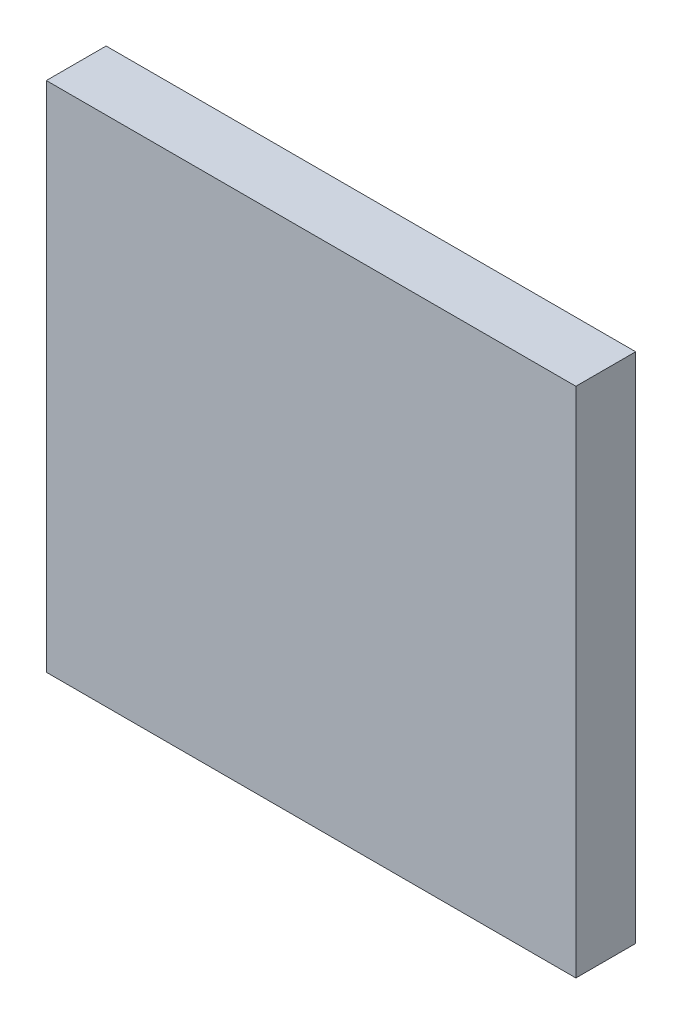
ISO-10303-21;
HEADER;
FILE_DESCRIPTION(('STEP AP214'),'2;1');
FILE_NAME('part.step','',(''),(''),'','','');
FILE_SCHEMA(('AUTOMOTIVE_DESIGN { 1 0 10303 214 1 1 1 1 }'));
ENDSEC;
DATA;
#1=APPLICATION_CONTEXT('core data for automotive mechanical design processes');
#2=APPLICATION_PROTOCOL_DEFINITION('international standard','automotive_design',2000,#1);
#3=PRODUCT_CONTEXT('',#1,'mechanical');
#4=PRODUCT('Part','Part','',(#3));
#5=PRODUCT_RELATED_PRODUCT_CATEGORY('part','',(#4));
#6=PRODUCT_DEFINITION_FORMATION('','',#4);
#7=PRODUCT_DEFINITION_CONTEXT('part definition',#1,'design');
#8=PRODUCT_DEFINITION('design','',#6,#7);
#9=PRODUCT_DEFINITION_SHAPE('','',#8);
#10=(LENGTH_UNIT() NAMED_UNIT(*) SI_UNIT(.MILLI.,.METRE.));
#11=(NAMED_UNIT(*) PLANE_ANGLE_UNIT() SI_UNIT($,.RADIAN.));
#12=(NAMED_UNIT(*) SI_UNIT($,.STERADIAN.) SOLID_ANGLE_UNIT());
#13=UNCERTAINTY_MEASURE_WITH_UNIT(LENGTH_MEASURE(1.E-05),#10,'distance_accuracy_value','');
#14=(GEOMETRIC_REPRESENTATION_CONTEXT(3) GLOBAL_UNCERTAINTY_ASSIGNED_CONTEXT((#13)) GLOBAL_UNIT_ASSIGNED_CONTEXT((#10,
#11,#12)) REPRESENTATION_CONTEXT('',''));
#15=CARTESIAN_POINT('',(0.,0.,0.));
#16=DIRECTION('',(0.,0.,1.));
#17=DIRECTION('',(1.,0.,0.));
#18=AXIS2_PLACEMENT_3D('',#15,#16,#17);
#19=CARTESIAN_POINT('',(0.,0.,1.4));
#20=DIRECTION('',(0.,0.,1.));
#21=DIRECTION('',(1.,0.,0.));
#22=AXIS2_PLACEMENT_3D('',#19,#20,#21);
#23=PLANE('',#22);
#24=DIRECTION('',(0.,1.,0.));
#25=VECTOR('',#24,1.);
#26=CARTESIAN_POINT('',(0.,0.,1.4));
#27=LINE('',#26,#25);
#28=CARTESIAN_POINT('',(0.,0.,1.4));
#29=VERTEX_POINT('',#28);
#30=CARTESIAN_POINT('',(0.,12.,1.4));
#31=VERTEX_POINT('',#30);
#32=EDGE_CURVE('E90',#29,#31,#27,.T.);
#33=ORIENTED_EDGE('',*,*,#32,.F.);
#34=DIRECTION('',(1.,0.,0.));
#35=VECTOR('',#34,1.);
#36=CARTESIAN_POINT('',(0.,0.,1.4));
#37=LINE('',#36,#35);
#38=CARTESIAN_POINT('',(12.4,0.,1.4));
#39=VERTEX_POINT('',#38);
#40=EDGE_CURVE('E21',#29,#39,#37,.T.);
#41=ORIENTED_EDGE('',*,*,#40,.T.);
#42=DIRECTION('',(0.,1.,0.));
#43=VECTOR('',#42,1.);
#44=CARTESIAN_POINT('',(12.4,0.,1.4));
#45=LINE('',#44,#43);
#46=CARTESIAN_POINT('',(12.4,12.,1.4));
#47=VERTEX_POINT('',#46);
#48=EDGE_CURVE('E82',#39,#47,#45,.T.);
#49=ORIENTED_EDGE('',*,*,#48,.T.);
#50=DIRECTION('',(1.,0.,0.));
#51=VECTOR('',#50,1.);
#52=CARTESIAN_POINT('',(0.,12.,1.4));
#53=LINE('',#52,#51);
#54=EDGE_CURVE('E11',#31,#47,#53,.T.);
#55=ORIENTED_EDGE('',*,*,#54,.F.);
#56=EDGE_LOOP('',(#33,#41,#49,#55));
#57=FACE_BOUND('',#56,.T.);
#58=ADVANCED_FACE('F17',(#57),#23,.T.);
#59=CARTESIAN_POINT('',(0.,0.,0.));
#60=DIRECTION('',(0.,0.,1.));
#61=DIRECTION('',(1.,0.,0.));
#62=AXIS2_PLACEMENT_3D('',#59,#60,#61);
#63=PLANE('',#62);
#64=DIRECTION('',(1.,0.,0.));
#65=VECTOR('',#64,1.);
#66=CARTESIAN_POINT('',(0.,12.,0.));
#67=LINE('',#66,#65);
#68=CARTESIAN_POINT('',(0.,12.,0.));
#69=VERTEX_POINT('',#68);
#70=CARTESIAN_POINT('',(12.4,12.,0.));
#71=VERTEX_POINT('',#70);
#72=EDGE_CURVE('E30',#69,#71,#67,.T.);
#73=ORIENTED_EDGE('',*,*,#72,.T.);
#74=DIRECTION('',(0.,1.,0.));
#75=VECTOR('',#74,1.);
#76=CARTESIAN_POINT('',(12.4,0.,0.));
#77=LINE('',#76,#75);
#78=CARTESIAN_POINT('',(12.4,0.,0.));
#79=VERTEX_POINT('',#78);
#80=EDGE_CURVE('E104',#79,#71,#77,.T.);
#81=ORIENTED_EDGE('',*,*,#80,.F.);
#82=DIRECTION('',(1.,0.,0.));
#83=VECTOR('',#82,1.);
#84=CARTESIAN_POINT('',(0.,0.,0.));
#85=LINE('',#84,#83);
#86=CARTESIAN_POINT('',(0.,0.,0.));
#87=VERTEX_POINT('',#86);
#88=EDGE_CURVE('E83',#87,#79,#85,.T.);
#89=ORIENTED_EDGE('',*,*,#88,.F.);
#90=DIRECTION('',(0.,1.,0.));
#91=VECTOR('',#90,1.);
#92=CARTESIAN_POINT('',(0.,0.,0.));
#93=LINE('',#92,#91);
#94=EDGE_CURVE('E89',#87,#69,#93,.T.);
#95=ORIENTED_EDGE('',*,*,#94,.T.);
#96=EDGE_LOOP('',(#73,#81,#89,#95));
#97=FACE_BOUND('',#96,.T.);
#98=ADVANCED_FACE('F118',(#97),#63,.F.);
#99=CARTESIAN_POINT('',(0.,12.,0.));
#100=DIRECTION('',(0.,1.,0.));
#101=DIRECTION('',(1.,0.,0.));
#102=AXIS2_PLACEMENT_3D('',#99,#100,#101);
#103=PLANE('',#102);
#104=ORIENTED_EDGE('',*,*,#72,.F.);
#105=DIRECTION('',(0.,0.,1.));
#106=VECTOR('',#105,1.);
#107=CARTESIAN_POINT('',(0.,12.,0.));
#108=LINE('',#107,#106);
#109=EDGE_CURVE('E94',#69,#31,#108,.T.);
#110=ORIENTED_EDGE('',*,*,#109,.T.);
#111=ORIENTED_EDGE('',*,*,#54,.T.);
#112=DIRECTION('',(0.,0.,1.));
#113=VECTOR('',#112,1.);
#114=CARTESIAN_POINT('',(12.4,12.,0.));
#115=LINE('',#114,#113);
#116=EDGE_CURVE('E103',#71,#47,#115,.T.);
#117=ORIENTED_EDGE('',*,*,#116,.F.);
#118=EDGE_LOOP('',(#104,#110,#111,#117));
#119=FACE_BOUND('',#118,.T.);
#120=ADVANCED_FACE('F19',(#119),#103,.T.);
#121=CARTESIAN_POINT('',(0.,0.,0.));
#122=DIRECTION('',(0.,1.,0.));
#123=DIRECTION('',(1.,0.,0.));
#124=AXIS2_PLACEMENT_3D('',#121,#122,#123);
#125=PLANE('',#124);
#126=DIRECTION('',(0.,0.,1.));
#127=VECTOR('',#126,1.);
#128=CARTESIAN_POINT('',(12.4,0.,0.));
#129=LINE('',#128,#127);
#130=EDGE_CURVE('E77',#79,#39,#129,.T.);
#131=ORIENTED_EDGE('',*,*,#130,.T.);
#132=ORIENTED_EDGE('',*,*,#40,.F.);
#133=DIRECTION('',(0.,0.,1.));
#134=VECTOR('',#133,1.);
#135=CARTESIAN_POINT('',(0.,0.,0.));
#136=LINE('',#135,#134);
#137=EDGE_CURVE('E74',#87,#29,#136,.T.);
#138=ORIENTED_EDGE('',*,*,#137,.F.);
#139=ORIENTED_EDGE('',*,*,#88,.T.);
#140=EDGE_LOOP('',(#131,#132,#138,#139));
#141=FACE_BOUND('',#140,.T.);
#142=ADVANCED_FACE('F72',(#141),#125,.F.);
#143=CARTESIAN_POINT('',(12.4,0.,0.));
#144=DIRECTION('',(1.,0.,0.));
#145=DIRECTION('',(0.,1.,0.));
#146=AXIS2_PLACEMENT_3D('',#143,#144,#145);
#147=PLANE('',#146);
#148=ORIENTED_EDGE('',*,*,#130,.F.);
#149=ORIENTED_EDGE('',*,*,#80,.T.);
#150=ORIENTED_EDGE('',*,*,#116,.T.);
#151=ORIENTED_EDGE('',*,*,#48,.F.);
#152=EDGE_LOOP('',(#148,#149,#150,#151));
#153=FACE_BOUND('',#152,.T.);
#154=ADVANCED_FACE('F119',(#153),#147,.T.);
#155=CARTESIAN_POINT('',(0.,0.,0.));
#156=DIRECTION('',(1.,0.,0.));
#157=DIRECTION('',(0.,1.,0.));
#158=AXIS2_PLACEMENT_3D('',#155,#156,#157);
#159=PLANE('',#158);
#160=ORIENTED_EDGE('',*,*,#32,.T.);
#161=ORIENTED_EDGE('',*,*,#109,.F.);
#162=ORIENTED_EDGE('',*,*,#94,.F.);
#163=ORIENTED_EDGE('',*,*,#137,.T.);
#164=EDGE_LOOP('',(#160,#161,#162,#163));
#165=FACE_BOUND('',#164,.T.);
#166=ADVANCED_FACE('F87',(#165),#159,.F.);
#167=CLOSED_SHELL('',(#58,#98,#120,#142,#154,#166));
#168=MANIFOLD_SOLID_BREP('B1',#167);
#169=ADVANCED_BREP_SHAPE_REPRESENTATION('',(#18,#168),#14);
#170=SHAPE_DEFINITION_REPRESENTATION(#9,#169);
ENDSEC;
END-ISO-10303-21;
